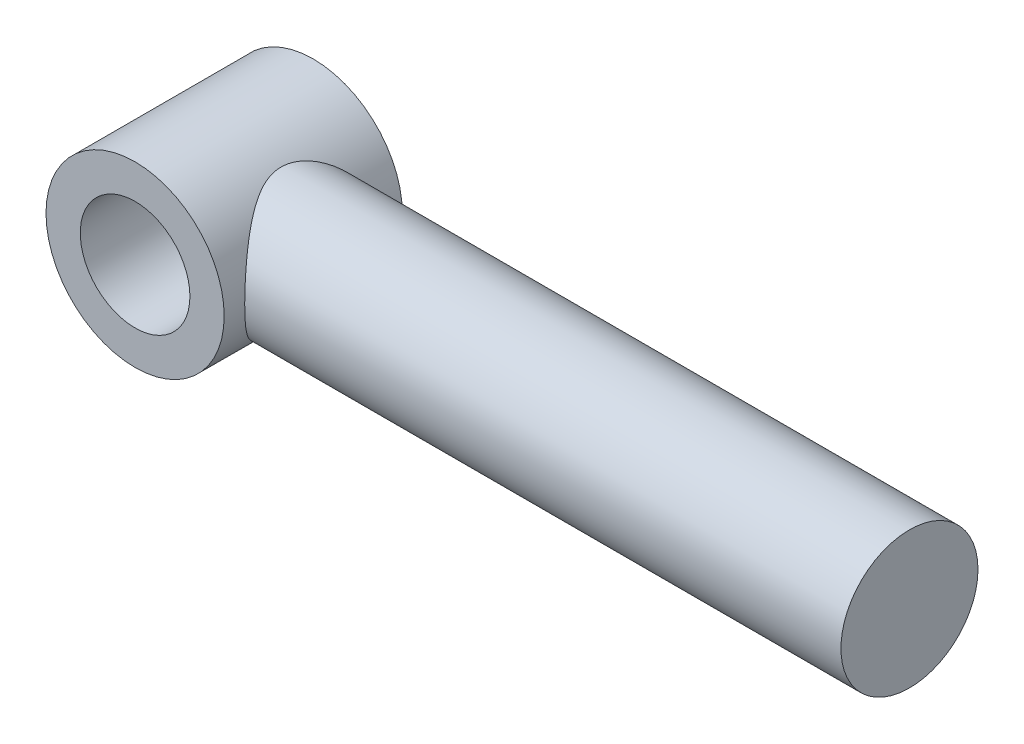
ISO-10303-21;
HEADER;
FILE_DESCRIPTION(('STEP AP214'),'2;1');
FILE_NAME('part.step','',(''),(''),'','','');
FILE_SCHEMA(('AUTOMOTIVE_DESIGN { 1 0 10303 214 1 1 1 1 }'));
ENDSEC;
DATA;
#1=APPLICATION_CONTEXT('core data for automotive mechanical design processes');
#2=APPLICATION_PROTOCOL_DEFINITION('international standard','automotive_design',2000,#1);
#3=PRODUCT_CONTEXT('',#1,'mechanical');
#4=PRODUCT('Part','Part','',(#3));
#5=PRODUCT_RELATED_PRODUCT_CATEGORY('part','',(#4));
#6=PRODUCT_DEFINITION_FORMATION('','',#4);
#7=PRODUCT_DEFINITION_CONTEXT('part definition',#1,'design');
#8=PRODUCT_DEFINITION('design','',#6,#7);
#9=PRODUCT_DEFINITION_SHAPE('','',#8);
#10=(LENGTH_UNIT() NAMED_UNIT(*) SI_UNIT(.MILLI.,.METRE.));
#11=(NAMED_UNIT(*) PLANE_ANGLE_UNIT() SI_UNIT($,.RADIAN.));
#12=(NAMED_UNIT(*) SI_UNIT($,.STERADIAN.) SOLID_ANGLE_UNIT());
#13=UNCERTAINTY_MEASURE_WITH_UNIT(LENGTH_MEASURE(1.E-05),#10,'distance_accuracy_value','');
#14=(GEOMETRIC_REPRESENTATION_CONTEXT(3) GLOBAL_UNCERTAINTY_ASSIGNED_CONTEXT((#13)) GLOBAL_UNIT_ASSIGNED_CONTEXT((#10,
#11,#12)) REPRESENTATION_CONTEXT('',''));
#15=CARTESIAN_POINT('',(0.,0.,0.));
#16=DIRECTION('',(0.,0.,1.));
#17=DIRECTION('',(1.,0.,0.));
#18=AXIS2_PLACEMENT_3D('',#15,#16,#17);
#19=CARTESIAN_POINT('',(0.,0.,32.5));
#20=DIRECTION('',(0.,0.,1.));
#21=DIRECTION('',(1.,0.,0.));
#22=AXIS2_PLACEMENT_3D('',#19,#20,#21);
#23=PLANE('',#22);
#24=CARTESIAN_POINT('',(0.,0.,32.5));
#25=DIRECTION('',(0.,0.,1.));
#26=DIRECTION('',(1.,0.,0.));
#27=AXIS2_PLACEMENT_3D('',#24,#25,#26);
#28=CIRCLE('',#27,32.5);
#29=CARTESIAN_POINT('',(32.5,0.,32.5));
#30=VERTEX_POINT('',#29);
#31=EDGE_CURVE('E10',#30,#30,#28,.T.);
#32=ORIENTED_EDGE('',*,*,#31,.T.);
#33=EDGE_LOOP('',(#32));
#34=FACE_BOUND('',#33,.T.);
#35=CARTESIAN_POINT('',(0.,0.,32.5));
#36=DIRECTION('',(0.,0.,1.));
#37=DIRECTION('',(1.,0.,0.));
#38=AXIS2_PLACEMENT_3D('',#35,#36,#37);
#39=CIRCLE('',#38,20.);
#40=CARTESIAN_POINT('',(20.,0.,32.5));
#41=VERTEX_POINT('',#40);
#42=EDGE_CURVE('E45',#41,#41,#39,.T.);
#43=ORIENTED_EDGE('',*,*,#42,.F.);
#44=EDGE_LOOP('',(#43));
#45=FACE_BOUND('',#44,.T.);
#46=ADVANCED_FACE('F34',(#34,#45),#23,.T.);
#47=CARTESIAN_POINT('',(0.,0.,-32.5));
#48=DIRECTION('',(0.,0.,1.));
#49=DIRECTION('',(1.,0.,0.));
#50=AXIS2_PLACEMENT_3D('',#47,#48,#49);
#51=PLANE('',#50);
#52=CARTESIAN_POINT('',(0.,0.,-32.5));
#53=DIRECTION('',(0.,0.,1.));
#54=DIRECTION('',(1.,0.,0.));
#55=AXIS2_PLACEMENT_3D('',#52,#53,#54);
#56=CIRCLE('',#55,32.5);
#57=CARTESIAN_POINT('',(32.5,0.,-32.5));
#58=VERTEX_POINT('',#57);
#59=EDGE_CURVE('E38',#58,#58,#56,.T.);
#60=ORIENTED_EDGE('',*,*,#59,.F.);
#61=EDGE_LOOP('',(#60));
#62=FACE_BOUND('',#61,.T.);
#63=CARTESIAN_POINT('',(0.,0.,-32.5));
#64=DIRECTION('',(0.,0.,1.));
#65=DIRECTION('',(1.,0.,0.));
#66=AXIS2_PLACEMENT_3D('',#63,#64,#65);
#67=CIRCLE('',#66,20.);
#68=CARTESIAN_POINT('',(20.,0.,-32.5));
#69=VERTEX_POINT('',#68);
#70=EDGE_CURVE('E47',#69,#69,#67,.T.);
#71=ORIENTED_EDGE('',*,*,#70,.T.);
#72=EDGE_LOOP('',(#71));
#73=FACE_BOUND('',#72,.T.);
#74=ADVANCED_FACE('F78',(#62,#73),#51,.F.);
#75=CARTESIAN_POINT('',(0.,0.,32.5));
#76=DIRECTION('',(0.,0.,-1.));
#77=DIRECTION('',(-1.,0.,0.));
#78=AXIS2_PLACEMENT_3D('',#75,#76,#77);
#79=CYLINDRICAL_SURFACE('',#78,32.5);
#80=CARTESIAN_POINT('',(32.5,0.,-25.));
#81=CARTESIAN_POINT('',(32.5000038771277,0.607017580442508,-25.0000039842105));
#82=CARTESIAN_POINT('',(32.4829615002094,1.21398712506151,-24.9778616543947));
#83=CARTESIAN_POINT('',(32.4152041537881,2.42305765641661,-24.8896819512528));
#84=CARTESIAN_POINT('',(32.3644773419374,3.02515685551916,-24.823629140426));
#85=CARTESIAN_POINT('',(32.2304498783548,4.22021258065677,-24.6486320023166));
#86=CARTESIAN_POINT('',(32.1471052396139,4.81315563196801,-24.5396297538997));
#87=CARTESIAN_POINT('',(31.9497478863129,5.98468764108991,-24.2805154798803));
#88=CARTESIAN_POINT('',(31.8357373551687,6.56327761763938,-24.1304063810777));
#89=CARTESIAN_POINT('',(31.5802296299976,7.6990904354934,-23.7922904250845));
#90=CARTESIAN_POINT('',(31.4388989141377,8.25641937261775,-23.6045128552146));
#91=CARTESIAN_POINT('',(31.1310658515406,9.35038355193799,-23.1929282156182));
#92=CARTESIAN_POINT('',(30.9645631218447,9.88701847914618,-22.9691205977391));
#93=CARTESIAN_POINT('',(30.6093911085819,10.9372020482812,-22.4880222890302));
#94=CARTESIAN_POINT('',(30.4207277680166,11.4507568289613,-22.2307405732536));
#95=CARTESIAN_POINT('',(30.0242364163581,12.4533496126239,-21.6850162259949));
#96=CARTESIAN_POINT('',(29.8164057951617,12.9423842625409,-21.396569349679));
#97=CARTESIAN_POINT('',(29.3644801029849,13.9393034445613,-20.7623876829549));
#98=CARTESIAN_POINT('',(29.1188114132661,14.444669621813,-20.4138178928713));
#99=CARTESIAN_POINT('',(28.612327671335,15.4236343139884,-19.6846162412376));
#100=CARTESIAN_POINT('',(28.3515118108462,15.8972311307386,-19.3039826682255));
#101=CARTESIAN_POINT('',(27.8184632470372,16.8126129899184,-18.5122320850768));
#102=CARTESIAN_POINT('',(27.5462160564142,17.2543556113856,-18.1010758530121));
#103=CARTESIAN_POINT('',(26.994805905907,18.1048995181007,-17.2503467024175));
#104=CARTESIAN_POINT('',(26.7156426166813,18.5136992306647,-16.8107724290227));
#105=CARTESIAN_POINT('',(26.0948692784798,19.3816875944363,-15.8075667500974));
#106=CARTESIAN_POINT('',(25.7526469360412,19.8330107784484,-15.2374805486639));
#107=CARTESIAN_POINT('',(25.0728961631907,20.685678351961,-14.0581817807974));
#108=CARTESIAN_POINT('',(24.7353692307365,21.0870071026694,-13.4489570612957));
#109=CARTESIAN_POINT('',(24.0751680510214,21.8377113114302,-12.1921924767445));
#110=CARTESIAN_POINT('',(23.7524817254291,22.1871295536865,-11.5446847865301));
#111=CARTESIAN_POINT('',(23.288536796563,22.6703347619693,-10.5447985332417));
#112=CARTESIAN_POINT('',(23.137264029424,22.8245561750602,-10.2068024598083));
#113=CARTESIAN_POINT('',(22.8430550986879,23.1189988992272,-9.52109015821872));
#114=CARTESIAN_POINT('',(22.7001206719989,23.2592172977216,-9.17337192705651));
#115=CARTESIAN_POINT('',(22.3845390606411,23.5636033626268,-8.36616589292507));
#116=CARTESIAN_POINT('',(22.2152901109582,23.722930260749,-7.90349812944218));
#117=CARTESIAN_POINT('',(21.8983396179782,24.0158136703657,-6.96298524523377));
#118=CARTESIAN_POINT('',(21.750631130459,24.1493784915478,-6.48514507655681));
#119=CARTESIAN_POINT('',(21.4816896215791,24.3889202250894,-5.5162531298614));
#120=CARTESIAN_POINT('',(21.3604060781083,24.4949498581154,-5.02522861542874));
#121=CARTESIAN_POINT('',(21.1486356870717,24.6780241034281,-4.03118523223187));
#122=CARTESIAN_POINT('',(21.0581484447107,24.7550690872867,-3.5281665173166));
#123=CARTESIAN_POINT('',(20.9112753599252,24.8792685078158,-2.50777253957479));
#124=CARTESIAN_POINT('',(20.8552710014183,24.9260888345678,-1.99030064577549));
#125=CARTESIAN_POINT('',(20.7818453052297,24.9873416792926,-0.950694822356147));
#126=CARTESIAN_POINT('',(20.7644222476983,25.001775640962,-0.428561101589513));
#127=CARTESIAN_POINT('',(20.7691175160494,24.9978751047376,0.615444255249985));
#128=CARTESIAN_POINT('',(20.7912393098569,24.9795377329292,1.13731586432203));
#129=CARTESIAN_POINT('',(20.8738169430081,24.9105723836607,2.17582653445851));
#130=CARTESIAN_POINT('',(20.9342728389074,24.8599443585612,2.69246558780203));
#131=CARTESIAN_POINT('',(21.0805754350123,24.7359498862798,3.65193571453493));
#132=CARTESIAN_POINT('',(21.162281303652,24.6662363414978,4.09588961535005));
#133=CARTESIAN_POINT('',(21.3497619298841,24.5041427517445,4.97460209447698));
#134=CARTESIAN_POINT('',(21.4555452218632,24.4117546687366,5.40935735240963));
#135=CARTESIAN_POINT('',(21.6880391087929,24.2054349974636,6.26835086234533));
#136=CARTESIAN_POINT('',(21.8147660672543,24.091486553691,6.69258059017935));
#137=CARTESIAN_POINT('',(22.0857849934811,23.8432776218556,7.52917680576061));
#138=CARTESIAN_POINT('',(22.2300748915656,23.7090195267045,7.94154468428439));
#139=CARTESIAN_POINT('',(22.6323566821777,23.3269321303195,9.02014631541278));
#140=CARTESIAN_POINT('',(22.9029337159264,23.0623019322474,9.67580048765735));
#141=CARTESIAN_POINT('',(23.4710402659833,22.4838783404637,10.9529528204919));
#142=CARTESIAN_POINT('',(23.7685846779668,22.1700577053004,11.5744317958469));
#143=CARTESIAN_POINT('',(24.3806678911183,21.4951398560733,12.784355606246));
#144=CARTESIAN_POINT('',(24.6952416837886,21.1339429477879,13.3727269335638));
#145=CARTESIAN_POINT('',(25.3318776152794,20.3665068655874,14.5147732289138));
#146=CARTESIAN_POINT('',(25.6539384876994,19.9602752658726,15.0684540069645));
#147=CARTESIAN_POINT('',(26.3085747029511,19.0896611089101,16.1581847734859));
#148=CARTESIAN_POINT('',(26.6411489541141,18.6238097862945,16.693063444603));
#149=CARTESIAN_POINT('',(27.2987982724179,17.6457655248564,17.7237624805388));
#150=CARTESIAN_POINT('',(27.623872579217,17.133567913145,18.2195788974361));
#151=CARTESIAN_POINT('',(28.2590575408407,16.0642953119674,19.1689471407942));
#152=CARTESIAN_POINT('',(28.5691911417532,15.5072928913014,19.6225648435086));
#153=CARTESIAN_POINT('',(29.0183569107757,14.6386916715975,20.2691629480637));
#154=CARTESIAN_POINT('',(29.1653988134381,14.3436586584244,20.4790470510997));
#155=CARTESIAN_POINT('',(29.4533848522686,13.7426049157145,20.8871444397321));
#156=CARTESIAN_POINT('',(29.5943274262212,13.4365814074911,21.0853547399657));
#157=CARTESIAN_POINT('',(29.956663557735,12.615793226069,21.5916630205469));
#158=CARTESIAN_POINT('',(30.1722265614928,12.0920301126487,21.8894934739592));
#159=CARTESIAN_POINT('',(30.5809465844075,11.0175339835095,22.4495192270896));
#160=CARTESIAN_POINT('',(30.77410812776,10.4668064455861,22.7117217240668));
#161=CARTESIAN_POINT('',(31.1344437767735,9.34054575436349,23.1976324307573));
#162=CARTESIAN_POINT('',(31.3016255484907,8.76501998274422,23.4213519980235));
#163=CARTESIAN_POINT('',(31.6066386805141,7.59194464073981,23.8274544240039));
#164=CARTESIAN_POINT('',(31.7444697719714,6.99439486867618,24.009836904076));
#165=CARTESIAN_POINT('',(31.9885670578585,5.77666754843425,24.3316564972173));
#166=CARTESIAN_POINT('',(32.0945976489876,5.15635756031114,24.4707733313313));
#167=CARTESIAN_POINT('',(32.2711259820649,3.90198784331942,24.7018448473742));
#168=CARTESIAN_POINT('',(32.3416235721627,3.26792805570306,24.7937993277547));
#169=CARTESIAN_POINT('',(32.4452136087232,1.99189401501995,24.9287737341872));
#170=CARTESIAN_POINT('',(32.4783249003452,1.34992391439662,24.9718183141232));
#171=CARTESIAN_POINT('',(32.506299832509,0.0637763209591235,25.0081922067544));
#172=CARTESIAN_POINT('',(32.5011674285146,-0.580400936685175,25.001526660862));
#173=CARTESIAN_POINT('',(32.4556363495639,-1.79007891973346,24.9423055255628));
#174=CARTESIAN_POINT('',(32.4194093795042,-2.35601518659202,24.8951781690368));
#175=CARTESIAN_POINT('',(32.3179990552853,-3.48076039235845,24.762973738293));
#176=CARTESIAN_POINT('',(32.252818367554,-4.03956998270789,24.6779001586449));
#177=CARTESIAN_POINT('',(32.0948152455998,-5.1464002149896,24.4710362650651));
#178=CARTESIAN_POINT('',(32.0019899753532,-5.69441974383023,24.3492421840065));
#179=CARTESIAN_POINT('',(31.7904843554643,-6.77635484144525,24.0705862052741));
#180=CARTESIAN_POINT('',(31.6718028319539,-7.31026976863947,23.9137227154484));
#181=CARTESIAN_POINT('',(31.408496807996,-8.37016017134663,23.5638952370257));
#182=CARTESIAN_POINT('',(31.2634654028287,-8.89584616859286,23.370362630436));
#183=CARTESIAN_POINT('',(30.9513575288835,-9.92743217434952,22.9511679188064));
#184=CARTESIAN_POINT('',(30.7842810756138,-10.4333321967786,22.7255058363687));
#185=CARTESIAN_POINT('',(30.4307154713903,-11.4235705522947,22.2442151137646));
#186=CARTESIAN_POINT('',(30.2442267459722,-11.9079093576924,21.9885871304643));
#187=CARTESIAN_POINT('',(29.8545109167218,-12.8537895212174,21.4493947362026));
#188=CARTESIAN_POINT('',(29.651281584228,-13.3153278308095,21.1658266046063));
#189=CARTESIAN_POINT('',(29.1969594249691,-14.2870433946156,20.5248992227077));
#190=CARTESIAN_POINT('',(28.9434273435936,-14.7930944692704,20.1630088364084));
#191=CARTESIAN_POINT('',(28.4217247281211,-15.7722343823009,19.4066850241065));
#192=CARTESIAN_POINT('',(28.1535528196354,-16.2453201163629,19.0122485408882));
#193=CARTESIAN_POINT('',(27.606410625029,-17.1586688265517,18.1922340355443));
#194=CARTESIAN_POINT('',(27.3274230882181,-17.5988757898029,17.7666052115815));
#195=CARTESIAN_POINT('',(26.7635066103945,-18.4451434692231,16.8863697784321));
#196=CARTESIAN_POINT('',(26.4785774598794,-18.8512029787968,16.4317621462805));
#197=CARTESIAN_POINT('',(25.8484280727769,-19.7090658563955,15.3978075692564));
#198=CARTESIAN_POINT('',(25.5029069926335,-20.1530016433131,14.8120866202869));
#199=CARTESIAN_POINT('',(24.818988948512,-20.9895163779104,13.6008190931224));
#200=CARTESIAN_POINT('',(24.4805944553006,-21.3820777524031,12.9752589957162));
#201=CARTESIAN_POINT('',(23.8220291520669,-22.1133996430726,11.6853056275552));
#202=CARTESIAN_POINT('',(23.5018347709448,-22.4522308134834,11.02096495297));
#203=CARTESIAN_POINT('',(23.0448011994542,-22.9179978197903,9.99530779925191));
#204=CARTESIAN_POINT('',(22.8963651221669,-23.066143738965,9.64864917418297));
#205=CARTESIAN_POINT('',(22.6090286414575,-23.3478534860633,8.94545907565053));
#206=CARTESIAN_POINT('',(22.4701301735467,-23.4814143574026,8.58892561872194));
#207=CARTESIAN_POINT('',(22.1708378349888,-23.7646019152509,7.77637259953933));
#208=CARTESIAN_POINT('',(22.0136833351901,-23.9099693717966,7.31765350892448));
#209=CARTESIAN_POINT('',(21.7218041558748,-24.1754456093215,6.3861002158493));
#210=CARTESIAN_POINT('',(21.5870718951032,-24.2955629313337,5.91327084828892));
#211=CARTESIAN_POINT('',(21.3446771430366,-24.5087906081074,4.95572528193243));
#212=CARTESIAN_POINT('',(21.2369604754883,-24.60195507189,4.47103504731828));
#213=CARTESIAN_POINT('',(21.0524810477208,-24.7600053398356,3.49117973963363));
#214=CARTESIAN_POINT('',(20.9757180210982,-24.8248913873778,2.99601475675294));
#215=CARTESIAN_POINT('',(20.8560757331821,-24.9254958793935,1.99387372928107));
#216=CARTESIAN_POINT('',(20.8135188222145,-24.960936943871,1.4868306251649));
#217=CARTESIAN_POINT('',(20.765662181023,-25.0007654600387,0.469771763315389));
#218=CARTESIAN_POINT('',(20.7603604994791,-25.0051545381413,-0.0402438373268651));
#219=CARTESIAN_POINT('',(20.7872987561443,-24.9827641059019,-1.05884201447517));
#220=CARTESIAN_POINT('',(20.81955780257,-24.9559687311401,-1.56742372953233));
#221=CARTESIAN_POINT('',(20.9199725959873,-24.8718508309493,-2.57846552569318));
#222=CARTESIAN_POINT('',(20.9881325904728,-24.8145246933719,-3.08092487525248));
#223=CARTESIAN_POINT('',(21.1661386094957,-24.6629202084495,-4.12916031835734));
#224=CARTESIAN_POINT('',(21.2796592060807,-24.5653492833252,-4.6738315784353));
#225=CARTESIAN_POINT('',(21.5409629635633,-24.336535312366,-5.74757346385249));
#226=CARTESIAN_POINT('',(21.6887513356121,-24.2052871448591,-6.27664170260995));
#227=CARTESIAN_POINT('',(22.0127360812612,-23.9110302271178,-7.31821042067732));
#228=CARTESIAN_POINT('',(22.1889949422637,-23.7479514467154,-7.83067140983727));
#229=CARTESIAN_POINT('',(22.5637046223484,-23.3922212481039,-8.83678545431633));
#230=CARTESIAN_POINT('',(22.7621576372949,-23.1995669030179,-9.33043664212553));
#231=CARTESIAN_POINT('',(23.2634381466351,-22.6987953392215,-10.503627606681));
#232=CARTESIAN_POINT('',(23.5748841373454,-22.3763259203139,-11.1733861898865));
#233=CARTESIAN_POINT('',(24.2184783617863,-21.6781233581905,-12.4741400856871));
#234=CARTESIAN_POINT('',(24.5506348625549,-21.3023688678544,-13.1051197166911));
#235=CARTESIAN_POINT('',(25.2250484116814,-20.4993219471338,-14.3287762043441));
#236=CARTESIAN_POINT('',(25.5673159211313,-20.0719746187539,-14.9214112118848));
#237=CARTESIAN_POINT('',(26.2522925792226,-19.1673955968186,-16.0668418062627));
#238=CARTESIAN_POINT('',(26.5950016590686,-18.690170919387,-16.6196429779944));
#239=CARTESIAN_POINT('',(27.280227532337,-17.6754702867662,-17.695665541139));
#240=CARTESIAN_POINT('',(27.6225723258632,-17.1368949214871,-18.2179619310195));
#241=CARTESIAN_POINT('',(28.2911234016973,-16.0091249016623,-19.2165324539925));
#242=CARTESIAN_POINT('',(28.6173275875035,-15.4199236983893,-19.6928006161018));
#243=CARTESIAN_POINT('',(29.2450814249132,-14.1932764769525,-20.5943980616749));
#244=CARTESIAN_POINT('',(29.5466738044218,-13.5559179365205,-21.0198162482239));
#245=CARTESIAN_POINT('',(30.1179314757621,-12.234291003346,-21.8155093985746));
#246=CARTESIAN_POINT('',(30.3876099706821,-11.5500421958816,-22.1858071826936));
#247=CARTESIAN_POINT('',(30.8215048553399,-10.3242112432227,-22.7759487370887));
#248=CARTESIAN_POINT('',(30.9947927365995,-9.79250603190871,-23.0097345908654));
#249=CARTESIAN_POINT('',(31.3168861173979,-8.70762041136956,-23.4418027529092));
#250=CARTESIAN_POINT('',(31.4656931932458,-8.15444138767148,-23.6400873471606));
#251=CARTESIAN_POINT('',(31.7357380113993,-7.03038969385999,-23.9983520306988));
#252=CARTESIAN_POINT('',(31.8570258237272,-6.45955134066285,-24.1584017151667));
#253=CARTESIAN_POINT('',(32.06985132552,-5.30286244105967,-24.438363836231));
#254=CARTESIAN_POINT('',(32.1613987302031,-4.71701686462673,-24.5582893804549));
#255=CARTESIAN_POINT('',(32.3237977414811,-3.44796323155611,-24.7706135680445));
#256=CARTESIAN_POINT('',(32.3896930148181,-2.76300227417163,-24.8564589448406));
#257=CARTESIAN_POINT('',(32.4777968904719,-1.38534117754691,-24.9711563564114));
#258=CARTESIAN_POINT('',(32.4999955759913,-0.692639317397761,-24.999995453804));
#259=CARTESIAN_POINT('',(32.5,0.,-25.));
#260=B_SPLINE_CURVE_WITH_KNOTS('',3,(#80,#81,#82,#83,#84,#85,#86,#87,#88,#89,#90,#91,#92,#93,
#94,#95,#96,#97,#98,#99,#100,#101,#102,#103,#104,#105,#106,#107,#108,#109,#110,#111,#112,#113,
#114,#115,#116,#117,#118,#119,#120,#121,#122,#123,#124,#125,#126,#127,#128,#129,#130,#131,#132,
#133,#134,#135,#136,#137,#138,#139,#140,#141,#142,#143,#144,#145,#146,#147,#148,#149,#150,#151,
#152,#153,#154,#155,#156,#157,#158,#159,#160,#161,#162,#163,#164,#165,#166,#167,#168,#169,#170,
#171,#172,#173,#174,#175,#176,#177,#178,#179,#180,#181,#182,#183,#184,#185,#186,#187,#188,#189,
#190,#191,#192,#193,#194,#195,#196,#197,#198,#199,#200,#201,#202,#203,#204,#205,#206,#207,#208,
#209,#210,#211,#212,#213,#214,#215,#216,#217,#218,#219,#220,#221,#222,#223,#224,#225,#226,#227,
#228,#229,#230,#231,#232,#233,#234,#235,#236,#237,#238,#239,#240,#241,#242,#243,#244,#245,#246,
#247,#248,#249,#250,#251,#252,#253,#254,#255,#256,#257,#258,#259),.UNSPECIFIED.,.T.,.F.,(4,2,2,
2,2,2,2,2,2,2,2,2,2,2,2,2,2,2,2,2,2,2,2,2,2,2,2,2,2,2,2,2,2,2,2,2,2,2,2,2,2,2,2,2,2,2,2,2,2,2,2,
2,2,2,2,2,2,2,2,2,2,2,2,2,2,2,2,2,2,2,2,2,2,2,2,2,2,2,2,2,2,2,2,2,2,2,2,2,2,4),(0.,
1.82033352983382,3.64130736857118,5.46474540396704,7.2880536446632,9.10058298347612,
10.913139900283,12.7252118331725,14.5375308902195,16.5194403949895,18.5014557548514,
20.4860636448924,22.4707662234246,24.879034842744,27.2880549125234,29.6950783398923,
30.8981111809551,32.1013937300437,33.6534958255746,35.2050964424471,36.753703987872,
38.3022916800695,39.8677172435988,41.4330730233023,42.9985660851716,44.5640614566694,
45.9330065020314,47.302437535892,48.6729436235298,50.043288361803,52.3109484795428,
54.5798688836788,56.8536427777334,59.1270348335681,61.4748826622731,63.8229674783112,
66.1673229351566,67.3393728381096,68.5117211815591,70.4295249372358,72.3469406965714,
74.2637895901459,76.1806560410785,78.1113919615871,80.0421361330318,81.9719066470335,
83.9014775717519,85.6065960924315,87.3115576165732,89.0166941109042,90.7219080341948,
92.4561240660016,94.1903388778348,95.9245156819998,97.6589237297956,99.6724589387434,
101.686183504795,103.703263936115,105.720415610758,108.154082587988,110.588579864159,
113.019848788046,114.234912997101,115.450223060458,116.967631875173,118.484526586967,
119.998354593435,121.512169570825,123.04008840894,124.567927218533,126.096543623148,
127.625340921254,129.317411138574,131.009738840466,132.705832657173,134.402094432181,
136.81648605113,139.231847673163,141.649802425717,144.067417507148,146.538519820648,
149.009942267276,151.476978585525,153.942990671813,155.759653919162,157.576200146481,
159.389414264334,161.202035467444,163.278661531932,165.35575882559),.UNSPECIFIED.);
#261=CARTESIAN_POINT('',(32.5,0.,-25.));
#262=VERTEX_POINT('',#261);
#263=EDGE_CURVE('E50',#262,#262,#260,.T.);
#264=ORIENTED_EDGE('',*,*,#263,.F.);
#265=EDGE_LOOP('',(#264));
#266=FACE_BOUND('',#265,.T.);
#267=ORIENTED_EDGE('',*,*,#31,.F.);
#268=EDGE_LOOP('',(#267));
#269=FACE_BOUND('',#268,.T.);
#270=ORIENTED_EDGE('',*,*,#59,.T.);
#271=EDGE_LOOP('',(#270));
#272=FACE_BOUND('',#271,.T.);
#273=ADVANCED_FACE('F36',(#266,#269,#272),#79,.T.);
#274=CARTESIAN_POINT('',(0.,0.,32.5));
#275=DIRECTION('',(0.,0.,-1.));
#276=DIRECTION('',(-1.,0.,0.));
#277=AXIS2_PLACEMENT_3D('',#274,#275,#276);
#278=CYLINDRICAL_SURFACE('',#277,20.);
#279=ORIENTED_EDGE('',*,*,#42,.T.);
#280=EDGE_LOOP('',(#279));
#281=FACE_BOUND('',#280,.T.);
#282=ORIENTED_EDGE('',*,*,#70,.F.);
#283=EDGE_LOOP('',(#282));
#284=FACE_BOUND('',#283,.T.);
#285=ADVANCED_FACE('F68',(#281,#284),#278,.F.);
#286=CARTESIAN_POINT('',(250.,0.,0.));
#287=DIRECTION('',(1.,0.,0.));
#288=DIRECTION('',(0.,0.,-1.));
#289=AXIS2_PLACEMENT_3D('',#286,#287,#288);
#290=PLANE('',#289);
#291=CARTESIAN_POINT('',(250.,0.,0.));
#292=DIRECTION('',(1.,0.,0.));
#293=DIRECTION('',(0.,0.,-1.));
#294=AXIS2_PLACEMENT_3D('',#291,#292,#293);
#295=CIRCLE('',#294,25.);
#296=CARTESIAN_POINT('',(250.,0.,-25.));
#297=VERTEX_POINT('',#296);
#298=EDGE_CURVE('E60',#297,#297,#295,.T.);
#299=ORIENTED_EDGE('',*,*,#298,.T.);
#300=EDGE_LOOP('',(#299));
#301=FACE_BOUND('',#300,.T.);
#302=ADVANCED_FACE('F66',(#301),#290,.T.);
#303=CARTESIAN_POINT('',(-32.501,0.,0.));
#304=DIRECTION('',(1.,0.,0.));
#305=DIRECTION('',(0.,0.,-1.));
#306=AXIS2_PLACEMENT_3D('',#303,#304,#305);
#307=CYLINDRICAL_SURFACE('',#306,25.);
#308=ORIENTED_EDGE('',*,*,#298,.F.);
#309=EDGE_LOOP('',(#308));
#310=FACE_BOUND('',#309,.T.);
#311=ORIENTED_EDGE('',*,*,#263,.T.);
#312=EDGE_LOOP('',(#311));
#313=FACE_BOUND('',#312,.T.);
#314=ADVANCED_FACE('F61',(#310,#313),#307,.T.);
#315=CLOSED_SHELL('',(#46,#74,#273,#285,#302,#314));
#316=MANIFOLD_SOLID_BREP('B2',#315);
#317=ADVANCED_BREP_SHAPE_REPRESENTATION('',(#18,#316),#14);
#318=SHAPE_DEFINITION_REPRESENTATION(#9,#317);
ENDSEC;
END-ISO-10303-21;
